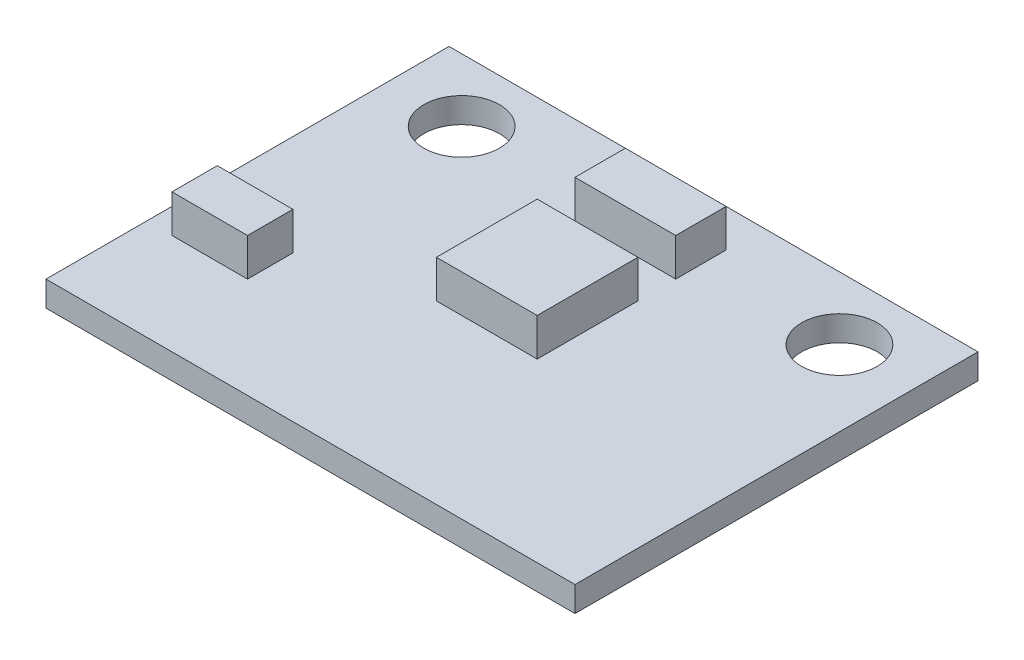
ISO-10303-21;
HEADER;
FILE_DESCRIPTION(('STEP AP214'),'2;1');
FILE_NAME('part.step','',(''),(''),'','','');
FILE_SCHEMA(('AUTOMOTIVE_DESIGN { 1 0 10303 214 1 1 1 1 }'));
ENDSEC;
DATA;
#1=APPLICATION_CONTEXT('core data for automotive mechanical design processes');
#2=APPLICATION_PROTOCOL_DEFINITION('international standard','automotive_design',2000,#1);
#3=PRODUCT_CONTEXT('',#1,'mechanical');
#4=PRODUCT('Part','Part','',(#3));
#5=PRODUCT_RELATED_PRODUCT_CATEGORY('part','',(#4));
#6=PRODUCT_DEFINITION_FORMATION('','',#4);
#7=PRODUCT_DEFINITION_CONTEXT('part definition',#1,'design');
#8=PRODUCT_DEFINITION('design','',#6,#7);
#9=PRODUCT_DEFINITION_SHAPE('','',#8);
#10=(LENGTH_UNIT() NAMED_UNIT(*) SI_UNIT(.MILLI.,.METRE.));
#11=(NAMED_UNIT(*) PLANE_ANGLE_UNIT() SI_UNIT($,.RADIAN.));
#12=(NAMED_UNIT(*) SI_UNIT($,.STERADIAN.) SOLID_ANGLE_UNIT());
#13=UNCERTAINTY_MEASURE_WITH_UNIT(LENGTH_MEASURE(1.E-05),#10,'distance_accuracy_value','');
#14=(GEOMETRIC_REPRESENTATION_CONTEXT(3) GLOBAL_UNCERTAINTY_ASSIGNED_CONTEXT((#13)) GLOBAL_UNIT_ASSIGNED_CONTEXT((#10,
#11,#12)) REPRESENTATION_CONTEXT('',''));
#15=CARTESIAN_POINT('',(0.,0.,0.));
#16=DIRECTION('',(0.,0.,1.));
#17=DIRECTION('',(1.,0.,0.));
#18=AXIS2_PLACEMENT_3D('',#15,#16,#17);
#19=CARTESIAN_POINT('',(0.,1.,0.));
#20=DIRECTION('',(0.,1.,0.));
#21=DIRECTION('',(0.,0.,1.));
#22=AXIS2_PLACEMENT_3D('',#19,#20,#21);
#23=PLANE('',#22);
#24=CARTESIAN_POINT('',(-7.5,1.,-5.5));
#25=DIRECTION('',(0.,1.,0.));
#26=DIRECTION('',(0.,0.,1.));
#27=AXIS2_PLACEMENT_3D('',#24,#25,#26);
#28=CIRCLE('',#27,1.5);
#29=CARTESIAN_POINT('',(-7.5,1.,-4.));
#30=VERTEX_POINT('',#29);
#31=EDGE_CURVE('E239',#30,#30,#28,.T.);
#32=ORIENTED_EDGE('',*,*,#31,.F.);
#33=EDGE_LOOP('',(#32));
#34=FACE_BOUND('',#33,.T.);
#35=DIRECTION('',(0.,0.,-1.));
#36=VECTOR('',#35,1.);
#37=CARTESIAN_POINT('',(10.5,1.,-8.));
#38=LINE('',#37,#36);
#39=CARTESIAN_POINT('',(10.5,1.,8.));
#40=VERTEX_POINT('',#39);
#41=CARTESIAN_POINT('',(10.5,1.,-8.));
#42=VERTEX_POINT('',#41);
#43=EDGE_CURVE('E245',#40,#42,#38,.T.);
#44=ORIENTED_EDGE('',*,*,#43,.T.);
#45=DIRECTION('',(-1.,0.,0.));
#46=VECTOR('',#45,1.);
#47=CARTESIAN_POINT('',(-10.5,1.,-8.));
#48=LINE('',#47,#46);
#49=CARTESIAN_POINT('',(-10.5,1.,-8.));
#50=VERTEX_POINT('',#49);
#51=EDGE_CURVE('E248',#42,#50,#48,.T.);
#52=ORIENTED_EDGE('',*,*,#51,.T.);
#53=DIRECTION('',(0.,0.,1.));
#54=VECTOR('',#53,1.);
#55=CARTESIAN_POINT('',(-10.5,1.,-8.));
#56=LINE('',#55,#54);
#57=CARTESIAN_POINT('',(-10.5,1.,8.));
#58=VERTEX_POINT('',#57);
#59=EDGE_CURVE('E251',#50,#58,#56,.T.);
#60=ORIENTED_EDGE('',*,*,#59,.T.);
#61=DIRECTION('',(1.,0.,0.));
#62=VECTOR('',#61,1.);
#63=CARTESIAN_POINT('',(-10.5,1.,8.));
#64=LINE('',#63,#62);
#65=EDGE_CURVE('E253',#58,#40,#64,.T.);
#66=ORIENTED_EDGE('',*,*,#65,.T.);
#67=EDGE_LOOP('',(#44,#52,#60,#66));
#68=FACE_BOUND('',#67,.T.);
#69=CARTESIAN_POINT('',(7.5,1.,-5.5));
#70=DIRECTION('',(0.,1.,0.));
#71=DIRECTION('',(0.,0.,1.));
#72=AXIS2_PLACEMENT_3D('',#69,#70,#71);
#73=CIRCLE('',#72,1.5);
#74=CARTESIAN_POINT('',(7.5,1.,-4.));
#75=VERTEX_POINT('',#74);
#76=EDGE_CURVE('E233',#75,#75,#73,.T.);
#77=ORIENTED_EDGE('',*,*,#76,.F.);
#78=EDGE_LOOP('',(#77));
#79=FACE_BOUND('',#78,.T.);
#80=DIRECTION('',(-1.,0.,0.));
#81=VECTOR('',#80,1.);
#82=CARTESIAN_POINT('',(-2.,1.,-3.));
#83=LINE('',#82,#81);
#84=CARTESIAN_POINT('',(2.,1.,-3.));
#85=VERTEX_POINT('',#84);
#86=CARTESIAN_POINT('',(-2.,1.,-3.));
#87=VERTEX_POINT('',#86);
#88=EDGE_CURVE('E217',#85,#87,#83,.T.);
#89=ORIENTED_EDGE('',*,*,#88,.F.);
#90=DIRECTION('',(0.,0.,-1.));
#91=VECTOR('',#90,1.);
#92=CARTESIAN_POINT('',(2.,1.,-3.));
#93=LINE('',#92,#91);
#94=CARTESIAN_POINT('',(2.,1.,1.));
#95=VERTEX_POINT('',#94);
#96=EDGE_CURVE('E203',#95,#85,#93,.T.);
#97=ORIENTED_EDGE('',*,*,#96,.F.);
#98=DIRECTION('',(1.,0.,0.));
#99=VECTOR('',#98,1.);
#100=CARTESIAN_POINT('',(-2.,1.,1.));
#101=LINE('',#100,#99);
#102=CARTESIAN_POINT('',(-2.,1.,1.));
#103=VERTEX_POINT('',#102);
#104=EDGE_CURVE('E208',#103,#95,#101,.T.);
#105=ORIENTED_EDGE('',*,*,#104,.F.);
#106=DIRECTION('',(0.,0.,1.));
#107=VECTOR('',#106,1.);
#108=CARTESIAN_POINT('',(-2.,1.,-3.));
#109=LINE('',#108,#107);
#110=EDGE_CURVE('E219',#87,#103,#109,.T.);
#111=ORIENTED_EDGE('',*,*,#110,.F.);
#112=EDGE_LOOP('',(#89,#97,#105,#111));
#113=FACE_BOUND('',#112,.T.);
#114=DIRECTION('',(1.,0.,0.));
#115=VECTOR('',#114,1.);
#116=CARTESIAN_POINT('',(-9.5,1.,4.));
#117=LINE('',#116,#115);
#118=CARTESIAN_POINT('',(-9.5,1.,4.));
#119=VERTEX_POINT('',#118);
#120=CARTESIAN_POINT('',(-6.5,1.,4.));
#121=VERTEX_POINT('',#120);
#122=EDGE_CURVE('E175',#119,#121,#117,.T.);
#123=ORIENTED_EDGE('',*,*,#122,.F.);
#124=DIRECTION('',(0.,0.,1.));
#125=VECTOR('',#124,1.);
#126=CARTESIAN_POINT('',(-9.5,1.,2.2));
#127=LINE('',#126,#125);
#128=CARTESIAN_POINT('',(-9.5,1.,2.2));
#129=VERTEX_POINT('',#128);
#130=EDGE_CURVE('E172',#129,#119,#127,.T.);
#131=ORIENTED_EDGE('',*,*,#130,.F.);
#132=DIRECTION('',(-1.,0.,0.));
#133=VECTOR('',#132,1.);
#134=CARTESIAN_POINT('',(-9.5,1.,2.2));
#135=LINE('',#134,#133);
#136=CARTESIAN_POINT('',(-6.5,1.,2.2));
#137=VERTEX_POINT('',#136);
#138=EDGE_CURVE('E184',#137,#129,#135,.T.);
#139=ORIENTED_EDGE('',*,*,#138,.F.);
#140=DIRECTION('',(0.,0.,-1.));
#141=VECTOR('',#140,1.);
#142=CARTESIAN_POINT('',(-6.5,1.,2.2));
#143=LINE('',#142,#141);
#144=EDGE_CURVE('E192',#121,#137,#143,.T.);
#145=ORIENTED_EDGE('',*,*,#144,.F.);
#146=EDGE_LOOP('',(#123,#131,#139,#145));
#147=FACE_BOUND('',#146,.T.);
#148=DIRECTION('',(1.,0.,0.));
#149=VECTOR('',#148,1.);
#150=CARTESIAN_POINT('',(-2.,1.,-4.5));
#151=LINE('',#150,#149);
#152=CARTESIAN_POINT('',(-2.,1.,-4.5));
#153=VERTEX_POINT('',#152);
#154=CARTESIAN_POINT('',(2.,1.,-4.5));
#155=VERTEX_POINT('',#154);
#156=EDGE_CURVE('E512',#153,#155,#151,.T.);
#157=ORIENTED_EDGE('',*,*,#156,.F.);
#158=DIRECTION('',(0.,0.,1.));
#159=VECTOR('',#158,1.);
#160=CARTESIAN_POINT('',(-2.,1.,-6.5));
#161=LINE('',#160,#159);
#162=CARTESIAN_POINT('',(-2.,1.,-6.5));
#163=VERTEX_POINT('',#162);
#164=EDGE_CURVE('E170',#163,#153,#161,.T.);
#165=ORIENTED_EDGE('',*,*,#164,.F.);
#166=DIRECTION('',(-1.,0.,0.));
#167=VECTOR('',#166,1.);
#168=CARTESIAN_POINT('',(-2.,1.,-6.5));
#169=LINE('',#168,#167);
#170=CARTESIAN_POINT('',(2.,1.,-6.5));
#171=VERTEX_POINT('',#170);
#172=EDGE_CURVE('E166',#171,#163,#169,.T.);
#173=ORIENTED_EDGE('',*,*,#172,.F.);
#174=DIRECTION('',(0.,0.,-1.));
#175=VECTOR('',#174,1.);
#176=CARTESIAN_POINT('',(2.,1.,-6.5));
#177=LINE('',#176,#175);
#178=EDGE_CURVE('E509',#155,#171,#177,.T.);
#179=ORIENTED_EDGE('',*,*,#178,.F.);
#180=EDGE_LOOP('',(#157,#165,#173,#179));
#181=FACE_BOUND('',#180,.T.);
#182=ADVANCED_FACE('F33',(#34,#68,#79,#113,#147,#181),#23,.T.);
#183=CARTESIAN_POINT('',(0.,0.,0.));
#184=DIRECTION('',(0.,1.,0.));
#185=DIRECTION('',(0.,0.,1.));
#186=AXIS2_PLACEMENT_3D('',#183,#184,#185);
#187=PLANE('',#186);
#188=DIRECTION('',(0.,0.,-1.));
#189=VECTOR('',#188,1.);
#190=CARTESIAN_POINT('',(10.5,0.,-8.));
#191=LINE('',#190,#189);
#192=CARTESIAN_POINT('',(10.5,0.,8.));
#193=VERTEX_POINT('',#192);
#194=CARTESIAN_POINT('',(10.5,0.,-8.));
#195=VERTEX_POINT('',#194);
#196=EDGE_CURVE('E242',#193,#195,#191,.T.);
#197=ORIENTED_EDGE('',*,*,#196,.F.);
#198=DIRECTION('',(1.,0.,0.));
#199=VECTOR('',#198,1.);
#200=CARTESIAN_POINT('',(-10.5,0.,8.));
#201=LINE('',#200,#199);
#202=CARTESIAN_POINT('',(-10.5,0.,8.));
#203=VERTEX_POINT('',#202);
#204=EDGE_CURVE('E249',#203,#193,#201,.T.);
#205=ORIENTED_EDGE('',*,*,#204,.F.);
#206=DIRECTION('',(0.,0.,1.));
#207=VECTOR('',#206,1.);
#208=CARTESIAN_POINT('',(-10.5,0.,-8.));
#209=LINE('',#208,#207);
#210=CARTESIAN_POINT('',(-10.5,0.,-8.));
#211=VERTEX_POINT('',#210);
#212=EDGE_CURVE('E260',#211,#203,#209,.T.);
#213=ORIENTED_EDGE('',*,*,#212,.F.);
#214=DIRECTION('',(-1.,0.,0.));
#215=VECTOR('',#214,1.);
#216=CARTESIAN_POINT('',(-10.5,0.,-8.));
#217=LINE('',#216,#215);
#218=EDGE_CURVE('E258',#195,#211,#217,.T.);
#219=ORIENTED_EDGE('',*,*,#218,.F.);
#220=EDGE_LOOP('',(#197,#205,#213,#219));
#221=FACE_BOUND('',#220,.T.);
#222=CARTESIAN_POINT('',(-7.5,0.,-5.5));
#223=DIRECTION('',(0.,1.,0.));
#224=DIRECTION('',(0.,0.,1.));
#225=AXIS2_PLACEMENT_3D('',#222,#223,#224);
#226=CIRCLE('',#225,1.5);
#227=CARTESIAN_POINT('',(-7.5,0.,-4.));
#228=VERTEX_POINT('',#227);
#229=EDGE_CURVE('E236',#228,#228,#226,.T.);
#230=ORIENTED_EDGE('',*,*,#229,.T.);
#231=EDGE_LOOP('',(#230));
#232=FACE_BOUND('',#231,.T.);
#233=CARTESIAN_POINT('',(7.5,0.,-5.5));
#234=DIRECTION('',(0.,1.,0.));
#235=DIRECTION('',(0.,0.,1.));
#236=AXIS2_PLACEMENT_3D('',#233,#234,#235);
#237=CIRCLE('',#236,1.5);
#238=CARTESIAN_POINT('',(7.5,0.,-4.));
#239=VERTEX_POINT('',#238);
#240=EDGE_CURVE('E232',#239,#239,#237,.T.);
#241=ORIENTED_EDGE('',*,*,#240,.T.);
#242=EDGE_LOOP('',(#241));
#243=FACE_BOUND('',#242,.T.);
#244=ADVANCED_FACE('F278',(#221,#232,#243),#187,.F.);
#245=CARTESIAN_POINT('',(10.5,1.,-8.));
#246=DIRECTION('',(-1.,0.,0.));
#247=DIRECTION('',(0.,0.,1.));
#248=AXIS2_PLACEMENT_3D('',#245,#246,#247);
#249=PLANE('',#248);
#250=ORIENTED_EDGE('',*,*,#196,.T.);
#251=DIRECTION('',(0.,-1.,0.));
#252=VECTOR('',#251,1.);
#253=CARTESIAN_POINT('',(10.5,1.,-8.));
#254=LINE('',#253,#252);
#255=EDGE_CURVE('E11',#42,#195,#254,.T.);
#256=ORIENTED_EDGE('',*,*,#255,.F.);
#257=ORIENTED_EDGE('',*,*,#43,.F.);
#258=DIRECTION('',(0.,-1.,0.));
#259=VECTOR('',#258,1.);
#260=CARTESIAN_POINT('',(10.5,1.,8.));
#261=LINE('',#260,#259);
#262=EDGE_CURVE('E255',#40,#193,#261,.T.);
#263=ORIENTED_EDGE('',*,*,#262,.T.);
#264=EDGE_LOOP('',(#250,#256,#257,#263));
#265=FACE_BOUND('',#264,.T.);
#266=ADVANCED_FACE('F35',(#265),#249,.F.);
#267=CARTESIAN_POINT('',(-10.5,1.,-8.));
#268=DIRECTION('',(0.,0.,1.));
#269=DIRECTION('',(1.,0.,0.));
#270=AXIS2_PLACEMENT_3D('',#267,#268,#269);
#271=PLANE('',#270);
#272=ORIENTED_EDGE('',*,*,#218,.T.);
#273=DIRECTION('',(0.,-1.,0.));
#274=VECTOR('',#273,1.);
#275=CARTESIAN_POINT('',(-10.5,1.,-8.));
#276=LINE('',#275,#274);
#277=EDGE_CURVE('E41',#50,#211,#276,.T.);
#278=ORIENTED_EDGE('',*,*,#277,.F.);
#279=ORIENTED_EDGE('',*,*,#51,.F.);
#280=ORIENTED_EDGE('',*,*,#255,.T.);
#281=EDGE_LOOP('',(#272,#278,#279,#280));
#282=FACE_BOUND('',#281,.T.);
#283=ADVANCED_FACE('F289',(#282),#271,.F.);
#284=CARTESIAN_POINT('',(-10.5,1.,-8.));
#285=DIRECTION('',(1.,0.,0.));
#286=DIRECTION('',(0.,0.,-1.));
#287=AXIS2_PLACEMENT_3D('',#284,#285,#286);
#288=PLANE('',#287);
#289=ORIENTED_EDGE('',*,*,#212,.T.);
#290=DIRECTION('',(0.,-1.,0.));
#291=VECTOR('',#290,1.);
#292=CARTESIAN_POINT('',(-10.5,1.,8.));
#293=LINE('',#292,#291);
#294=EDGE_CURVE('E265',#58,#203,#293,.T.);
#295=ORIENTED_EDGE('',*,*,#294,.F.);
#296=ORIENTED_EDGE('',*,*,#59,.F.);
#297=ORIENTED_EDGE('',*,*,#277,.T.);
#298=EDGE_LOOP('',(#289,#295,#296,#297));
#299=FACE_BOUND('',#298,.T.);
#300=ADVANCED_FACE('F272',(#299),#288,.F.);
#301=CARTESIAN_POINT('',(-10.5,1.,8.));
#302=DIRECTION('',(0.,0.,-1.));
#303=DIRECTION('',(-1.,0.,0.));
#304=AXIS2_PLACEMENT_3D('',#301,#302,#303);
#305=PLANE('',#304);
#306=ORIENTED_EDGE('',*,*,#204,.T.);
#307=ORIENTED_EDGE('',*,*,#262,.F.);
#308=ORIENTED_EDGE('',*,*,#65,.F.);
#309=ORIENTED_EDGE('',*,*,#294,.T.);
#310=EDGE_LOOP('',(#306,#307,#308,#309));
#311=FACE_BOUND('',#310,.T.);
#312=ADVANCED_FACE('F282',(#311),#305,.F.);
#313=CARTESIAN_POINT('',(-7.5,1.,-5.5));
#314=DIRECTION('',(0.,-1.,0.));
#315=DIRECTION('',(0.,0.,-1.));
#316=AXIS2_PLACEMENT_3D('',#313,#314,#315);
#317=CYLINDRICAL_SURFACE('',#316,1.5);
#318=ORIENTED_EDGE('',*,*,#31,.T.);
#319=EDGE_LOOP('',(#318));
#320=FACE_BOUND('',#319,.T.);
#321=ORIENTED_EDGE('',*,*,#229,.F.);
#322=EDGE_LOOP('',(#321));
#323=FACE_BOUND('',#322,.T.);
#324=ADVANCED_FACE('F305',(#320,#323),#317,.F.);
#325=CARTESIAN_POINT('',(7.5,1.,-5.5));
#326=DIRECTION('',(0.,-1.,0.));
#327=DIRECTION('',(0.,0.,-1.));
#328=AXIS2_PLACEMENT_3D('',#325,#326,#327);
#329=CYLINDRICAL_SURFACE('',#328,1.5);
#330=ORIENTED_EDGE('',*,*,#76,.T.);
#331=EDGE_LOOP('',(#330));
#332=FACE_BOUND('',#331,.T.);
#333=ORIENTED_EDGE('',*,*,#240,.F.);
#334=EDGE_LOOP('',(#333));
#335=FACE_BOUND('',#334,.T.);
#336=ADVANCED_FACE('F312',(#332,#335),#329,.F.);
#337=CARTESIAN_POINT('',(2.,2.5,-3.));
#338=DIRECTION('',(-1.,0.,0.));
#339=DIRECTION('',(0.,0.,1.));
#340=AXIS2_PLACEMENT_3D('',#337,#338,#339);
#341=PLANE('',#340);
#342=ORIENTED_EDGE('',*,*,#96,.T.);
#343=DIRECTION('',(0.,-1.,0.));
#344=VECTOR('',#343,1.);
#345=CARTESIAN_POINT('',(2.,2.5,-3.));
#346=LINE('',#345,#344);
#347=CARTESIAN_POINT('',(2.,2.5,-3.));
#348=VERTEX_POINT('',#347);
#349=EDGE_CURVE('E230',#348,#85,#346,.T.);
#350=ORIENTED_EDGE('',*,*,#349,.F.);
#351=DIRECTION('',(0.,0.,-1.));
#352=VECTOR('',#351,1.);
#353=CARTESIAN_POINT('',(2.,2.5,-3.));
#354=LINE('',#353,#352);
#355=CARTESIAN_POINT('',(2.,2.5,1.));
#356=VERTEX_POINT('',#355);
#357=EDGE_CURVE('E204',#356,#348,#354,.T.);
#358=ORIENTED_EDGE('',*,*,#357,.F.);
#359=DIRECTION('',(0.,-1.,0.));
#360=VECTOR('',#359,1.);
#361=CARTESIAN_POINT('',(2.,2.5,1.));
#362=LINE('',#361,#360);
#363=EDGE_CURVE('E214',#356,#95,#362,.T.);
#364=ORIENTED_EDGE('',*,*,#363,.T.);
#365=EDGE_LOOP('',(#342,#350,#358,#364));
#366=FACE_BOUND('',#365,.T.);
#367=ADVANCED_FACE('F317',(#366),#341,.F.);
#368=CARTESIAN_POINT('',(-2.,2.5,-3.));
#369=DIRECTION('',(0.,0.,1.));
#370=DIRECTION('',(1.,0.,0.));
#371=AXIS2_PLACEMENT_3D('',#368,#369,#370);
#372=PLANE('',#371);
#373=ORIENTED_EDGE('',*,*,#88,.T.);
#374=DIRECTION('',(0.,-1.,0.));
#375=VECTOR('',#374,1.);
#376=CARTESIAN_POINT('',(-2.,2.5,-3.));
#377=LINE('',#376,#375);
#378=CARTESIAN_POINT('',(-2.,2.5,-3.));
#379=VERTEX_POINT('',#378);
#380=EDGE_CURVE('E227',#379,#87,#377,.T.);
#381=ORIENTED_EDGE('',*,*,#380,.F.);
#382=DIRECTION('',(-1.,0.,0.));
#383=VECTOR('',#382,1.);
#384=CARTESIAN_POINT('',(-2.,2.5,-3.));
#385=LINE('',#384,#383);
#386=EDGE_CURVE('E207',#348,#379,#385,.T.);
#387=ORIENTED_EDGE('',*,*,#386,.F.);
#388=ORIENTED_EDGE('',*,*,#349,.T.);
#389=EDGE_LOOP('',(#373,#381,#387,#388));
#390=FACE_BOUND('',#389,.T.);
#391=ADVANCED_FACE('F327',(#390),#372,.F.);
#392=CARTESIAN_POINT('',(-2.,2.5,-3.));
#393=DIRECTION('',(1.,0.,0.));
#394=DIRECTION('',(0.,0.,-1.));
#395=AXIS2_PLACEMENT_3D('',#392,#393,#394);
#396=PLANE('',#395);
#397=ORIENTED_EDGE('',*,*,#110,.T.);
#398=DIRECTION('',(0.,-1.,0.));
#399=VECTOR('',#398,1.);
#400=CARTESIAN_POINT('',(-2.,2.5,1.));
#401=LINE('',#400,#399);
#402=CARTESIAN_POINT('',(-2.,2.5,1.));
#403=VERTEX_POINT('',#402);
#404=EDGE_CURVE('E225',#403,#103,#401,.T.);
#405=ORIENTED_EDGE('',*,*,#404,.F.);
#406=DIRECTION('',(0.,0.,1.));
#407=VECTOR('',#406,1.);
#408=CARTESIAN_POINT('',(-2.,2.5,-3.));
#409=LINE('',#408,#407);
#410=EDGE_CURVE('E210',#379,#403,#409,.T.);
#411=ORIENTED_EDGE('',*,*,#410,.F.);
#412=ORIENTED_EDGE('',*,*,#380,.T.);
#413=EDGE_LOOP('',(#397,#405,#411,#412));
#414=FACE_BOUND('',#413,.T.);
#415=ADVANCED_FACE('F333',(#414),#396,.F.);
#416=CARTESIAN_POINT('',(-2.,2.5,1.));
#417=DIRECTION('',(0.,0.,-1.));
#418=DIRECTION('',(-1.,0.,0.));
#419=AXIS2_PLACEMENT_3D('',#416,#417,#418);
#420=PLANE('',#419);
#421=ORIENTED_EDGE('',*,*,#104,.T.);
#422=ORIENTED_EDGE('',*,*,#363,.F.);
#423=DIRECTION('',(1.,0.,0.));
#424=VECTOR('',#423,1.);
#425=CARTESIAN_POINT('',(-2.,2.5,1.));
#426=LINE('',#425,#424);
#427=EDGE_CURVE('E212',#403,#356,#426,.T.);
#428=ORIENTED_EDGE('',*,*,#427,.F.);
#429=ORIENTED_EDGE('',*,*,#404,.T.);
#430=EDGE_LOOP('',(#421,#422,#428,#429));
#431=FACE_BOUND('',#430,.T.);
#432=ADVANCED_FACE('F337',(#431),#420,.F.);
#433=CARTESIAN_POINT('',(0.,2.5,0.));
#434=DIRECTION('',(0.,1.,0.));
#435=DIRECTION('',(0.,0.,1.));
#436=AXIS2_PLACEMENT_3D('',#433,#434,#435);
#437=PLANE('',#436);
#438=ORIENTED_EDGE('',*,*,#357,.T.);
#439=ORIENTED_EDGE('',*,*,#386,.T.);
#440=ORIENTED_EDGE('',*,*,#410,.T.);
#441=ORIENTED_EDGE('',*,*,#427,.T.);
#442=EDGE_LOOP('',(#438,#439,#440,#441));
#443=FACE_BOUND('',#442,.T.);
#444=ADVANCED_FACE('F341',(#443),#437,.T.);
#445=CARTESIAN_POINT('',(-9.5,2.5,2.2));
#446=DIRECTION('',(1.,0.,0.));
#447=DIRECTION('',(0.,0.,-1.));
#448=AXIS2_PLACEMENT_3D('',#445,#446,#447);
#449=PLANE('',#448);
#450=ORIENTED_EDGE('',*,*,#130,.T.);
#451=DIRECTION('',(0.,-1.,0.));
#452=VECTOR('',#451,1.);
#453=CARTESIAN_POINT('',(-9.5,2.5,4.));
#454=LINE('',#453,#452);
#455=CARTESIAN_POINT('',(-9.5,2.5,4.));
#456=VERTEX_POINT('',#455);
#457=EDGE_CURVE('E201',#456,#119,#454,.T.);
#458=ORIENTED_EDGE('',*,*,#457,.F.);
#459=DIRECTION('',(0.,0.,1.));
#460=VECTOR('',#459,1.);
#461=CARTESIAN_POINT('',(-9.5,2.5,2.2));
#462=LINE('',#461,#460);
#463=CARTESIAN_POINT('',(-9.5,2.5,2.2));
#464=VERTEX_POINT('',#463);
#465=EDGE_CURVE('E180',#464,#456,#462,.T.);
#466=ORIENTED_EDGE('',*,*,#465,.F.);
#467=DIRECTION('',(0.,-1.,0.));
#468=VECTOR('',#467,1.);
#469=CARTESIAN_POINT('',(-9.5,2.5,2.2));
#470=LINE('',#469,#468);
#471=EDGE_CURVE('E189',#464,#129,#470,.T.);
#472=ORIENTED_EDGE('',*,*,#471,.T.);
#473=EDGE_LOOP('',(#450,#458,#466,#472));
#474=FACE_BOUND('',#473,.T.);
#475=ADVANCED_FACE('F345',(#474),#449,.F.);
#476=CARTESIAN_POINT('',(-9.5,2.5,4.));
#477=DIRECTION('',(0.,0.,-1.));
#478=DIRECTION('',(-1.,0.,0.));
#479=AXIS2_PLACEMENT_3D('',#476,#477,#478);
#480=PLANE('',#479);
#481=ORIENTED_EDGE('',*,*,#122,.T.);
#482=DIRECTION('',(0.,-1.,0.));
#483=VECTOR('',#482,1.);
#484=CARTESIAN_POINT('',(-6.5,2.5,4.));
#485=LINE('',#484,#483);
#486=CARTESIAN_POINT('',(-6.5,2.5,4.));
#487=VERTEX_POINT('',#486);
#488=EDGE_CURVE('E198',#487,#121,#485,.T.);
#489=ORIENTED_EDGE('',*,*,#488,.F.);
#490=DIRECTION('',(1.,0.,0.));
#491=VECTOR('',#490,1.);
#492=CARTESIAN_POINT('',(-9.5,2.5,4.));
#493=LINE('',#492,#491);
#494=EDGE_CURVE('E183',#456,#487,#493,.T.);
#495=ORIENTED_EDGE('',*,*,#494,.F.);
#496=ORIENTED_EDGE('',*,*,#457,.T.);
#497=EDGE_LOOP('',(#481,#489,#495,#496));
#498=FACE_BOUND('',#497,.T.);
#499=ADVANCED_FACE('F349',(#498),#480,.F.);
#500=CARTESIAN_POINT('',(-6.5,2.5,2.2));
#501=DIRECTION('',(-1.,0.,0.));
#502=DIRECTION('',(0.,0.,1.));
#503=AXIS2_PLACEMENT_3D('',#500,#501,#502);
#504=PLANE('',#503);
#505=ORIENTED_EDGE('',*,*,#144,.T.);
#506=DIRECTION('',(0.,-1.,0.));
#507=VECTOR('',#506,1.);
#508=CARTESIAN_POINT('',(-6.5,2.5,2.2));
#509=LINE('',#508,#507);
#510=CARTESIAN_POINT('',(-6.5,2.5,2.2));
#511=VERTEX_POINT('',#510);
#512=EDGE_CURVE('E56',#511,#137,#509,.T.);
#513=ORIENTED_EDGE('',*,*,#512,.F.);
#514=DIRECTION('',(0.,0.,-1.));
#515=VECTOR('',#514,1.);
#516=CARTESIAN_POINT('',(-6.5,2.5,2.2));
#517=LINE('',#516,#515);
#518=EDGE_CURVE('E186',#487,#511,#517,.T.);
#519=ORIENTED_EDGE('',*,*,#518,.F.);
#520=ORIENTED_EDGE('',*,*,#488,.T.);
#521=EDGE_LOOP('',(#505,#513,#519,#520));
#522=FACE_BOUND('',#521,.T.);
#523=ADVANCED_FACE('F353',(#522),#504,.F.);
#524=CARTESIAN_POINT('',(-9.5,2.5,2.2));
#525=DIRECTION('',(0.,0.,1.));
#526=DIRECTION('',(1.,0.,0.));
#527=AXIS2_PLACEMENT_3D('',#524,#525,#526);
#528=PLANE('',#527);
#529=ORIENTED_EDGE('',*,*,#138,.T.);
#530=ORIENTED_EDGE('',*,*,#471,.F.);
#531=DIRECTION('',(-1.,0.,0.));
#532=VECTOR('',#531,1.);
#533=CARTESIAN_POINT('',(-9.5,2.5,2.2));
#534=LINE('',#533,#532);
#535=EDGE_CURVE('E188',#511,#464,#534,.T.);
#536=ORIENTED_EDGE('',*,*,#535,.F.);
#537=ORIENTED_EDGE('',*,*,#512,.T.);
#538=EDGE_LOOP('',(#529,#530,#536,#537));
#539=FACE_BOUND('',#538,.T.);
#540=ADVANCED_FACE('F357',(#539),#528,.F.);
#541=CARTESIAN_POINT('',(0.,2.5,0.));
#542=DIRECTION('',(0.,1.,0.));
#543=DIRECTION('',(0.,0.,1.));
#544=AXIS2_PLACEMENT_3D('',#541,#542,#543);
#545=PLANE('',#544);
#546=ORIENTED_EDGE('',*,*,#465,.T.);
#547=ORIENTED_EDGE('',*,*,#494,.T.);
#548=ORIENTED_EDGE('',*,*,#518,.T.);
#549=ORIENTED_EDGE('',*,*,#535,.T.);
#550=EDGE_LOOP('',(#546,#547,#548,#549));
#551=FACE_BOUND('',#550,.T.);
#552=ADVANCED_FACE('F361',(#551),#545,.T.);
#553=CARTESIAN_POINT('',(-2.,2.5,-6.5));
#554=DIRECTION('',(1.,0.,0.));
#555=DIRECTION('',(0.,0.,-1.));
#556=AXIS2_PLACEMENT_3D('',#553,#554,#555);
#557=PLANE('',#556);
#558=ORIENTED_EDGE('',*,*,#164,.T.);
#559=DIRECTION('',(0.,-1.,0.));
#560=VECTOR('',#559,1.);
#561=CARTESIAN_POINT('',(-2.,2.5,-4.5));
#562=LINE('',#561,#560);
#563=CARTESIAN_POINT('',(-2.,2.5,-4.5));
#564=VERTEX_POINT('',#563);
#565=EDGE_CURVE('E151',#564,#153,#562,.T.);
#566=ORIENTED_EDGE('',*,*,#565,.F.);
#567=DIRECTION('',(0.,0.,1.));
#568=VECTOR('',#567,1.);
#569=CARTESIAN_POINT('',(-2.,2.5,-6.5));
#570=LINE('',#569,#568);
#571=CARTESIAN_POINT('',(-2.,2.5,-6.5));
#572=VERTEX_POINT('',#571);
#573=EDGE_CURVE('E158',#572,#564,#570,.T.);
#574=ORIENTED_EDGE('',*,*,#573,.F.);
#575=DIRECTION('',(0.,-1.,0.));
#576=VECTOR('',#575,1.);
#577=CARTESIAN_POINT('',(-2.,2.5,-6.5));
#578=LINE('',#577,#576);
#579=EDGE_CURVE('E506',#572,#163,#578,.T.);
#580=ORIENTED_EDGE('',*,*,#579,.T.);
#581=EDGE_LOOP('',(#558,#566,#574,#580));
#582=FACE_BOUND('',#581,.T.);
#583=ADVANCED_FACE('F168',(#582),#557,.F.);
#584=CARTESIAN_POINT('',(-2.,2.5,-4.5));
#585=DIRECTION('',(0.,0.,-1.));
#586=DIRECTION('',(-1.,0.,0.));
#587=AXIS2_PLACEMENT_3D('',#584,#585,#586);
#588=PLANE('',#587);
#589=ORIENTED_EDGE('',*,*,#156,.T.);
#590=DIRECTION('',(0.,-1.,0.));
#591=VECTOR('',#590,1.);
#592=CARTESIAN_POINT('',(2.,2.5,-4.5));
#593=LINE('',#592,#591);
#594=CARTESIAN_POINT('',(2.,2.5,-4.5));
#595=VERTEX_POINT('',#594);
#596=EDGE_CURVE('E154',#595,#155,#593,.T.);
#597=ORIENTED_EDGE('',*,*,#596,.F.);
#598=DIRECTION('',(1.,0.,0.));
#599=VECTOR('',#598,1.);
#600=CARTESIAN_POINT('',(-2.,2.5,-4.5));
#601=LINE('',#600,#599);
#602=EDGE_CURVE('E147',#564,#595,#601,.T.);
#603=ORIENTED_EDGE('',*,*,#602,.F.);
#604=ORIENTED_EDGE('',*,*,#565,.T.);
#605=EDGE_LOOP('',(#589,#597,#603,#604));
#606=FACE_BOUND('',#605,.T.);
#607=ADVANCED_FACE('F149',(#606),#588,.F.);
#608=CARTESIAN_POINT('',(2.,2.5,-6.5));
#609=DIRECTION('',(-1.,0.,0.));
#610=DIRECTION('',(0.,0.,1.));
#611=AXIS2_PLACEMENT_3D('',#608,#609,#610);
#612=PLANE('',#611);
#613=ORIENTED_EDGE('',*,*,#178,.T.);
#614=DIRECTION('',(0.,-1.,0.));
#615=VECTOR('',#614,1.);
#616=CARTESIAN_POINT('',(2.,2.5,-6.5));
#617=LINE('',#616,#615);
#618=CARTESIAN_POINT('',(2.,2.5,-6.5));
#619=VERTEX_POINT('',#618);
#620=EDGE_CURVE('E48',#619,#171,#617,.T.);
#621=ORIENTED_EDGE('',*,*,#620,.F.);
#622=DIRECTION('',(0.,0.,-1.));
#623=VECTOR('',#622,1.);
#624=CARTESIAN_POINT('',(2.,2.5,-6.5));
#625=LINE('',#624,#623);
#626=EDGE_CURVE('E157',#595,#619,#625,.T.);
#627=ORIENTED_EDGE('',*,*,#626,.F.);
#628=ORIENTED_EDGE('',*,*,#596,.T.);
#629=EDGE_LOOP('',(#613,#621,#627,#628));
#630=FACE_BOUND('',#629,.T.);
#631=ADVANCED_FACE('F369',(#630),#612,.F.);
#632=CARTESIAN_POINT('',(-2.,2.5,-6.5));
#633=DIRECTION('',(0.,0.,1.));
#634=DIRECTION('',(1.,0.,0.));
#635=AXIS2_PLACEMENT_3D('',#632,#633,#634);
#636=PLANE('',#635);
#637=ORIENTED_EDGE('',*,*,#172,.T.);
#638=ORIENTED_EDGE('',*,*,#579,.F.);
#639=DIRECTION('',(-1.,0.,0.));
#640=VECTOR('',#639,1.);
#641=CARTESIAN_POINT('',(-2.,2.5,-6.5));
#642=LINE('',#641,#640);
#643=EDGE_CURVE('E162',#619,#572,#642,.T.);
#644=ORIENTED_EDGE('',*,*,#643,.F.);
#645=ORIENTED_EDGE('',*,*,#620,.T.);
#646=EDGE_LOOP('',(#637,#638,#644,#645));
#647=FACE_BOUND('',#646,.T.);
#648=ADVANCED_FACE('F372',(#647),#636,.F.);
#649=CARTESIAN_POINT('',(0.,2.5,0.));
#650=DIRECTION('',(0.,1.,0.));
#651=DIRECTION('',(0.,0.,1.));
#652=AXIS2_PLACEMENT_3D('',#649,#650,#651);
#653=PLANE('',#652);
#654=ORIENTED_EDGE('',*,*,#573,.T.);
#655=ORIENTED_EDGE('',*,*,#602,.T.);
#656=ORIENTED_EDGE('',*,*,#626,.T.);
#657=ORIENTED_EDGE('',*,*,#643,.T.);
#658=EDGE_LOOP('',(#654,#655,#656,#657));
#659=FACE_BOUND('',#658,.T.);
#660=ADVANCED_FACE('F161',(#659),#653,.T.);
#661=CLOSED_SHELL('',(#182,#244,#266,#283,#300,#312,#324,#336,#367,#391,#415,#432,#444,#475,
#499,#523,#540,#552,#583,#607,#631,#648,#660));
#662=MANIFOLD_SOLID_BREP('B2',#661);
#663=ADVANCED_BREP_SHAPE_REPRESENTATION('',(#18,#662),#14);
#664=SHAPE_DEFINITION_REPRESENTATION(#9,#663);
ENDSEC;
END-ISO-10303-21;
